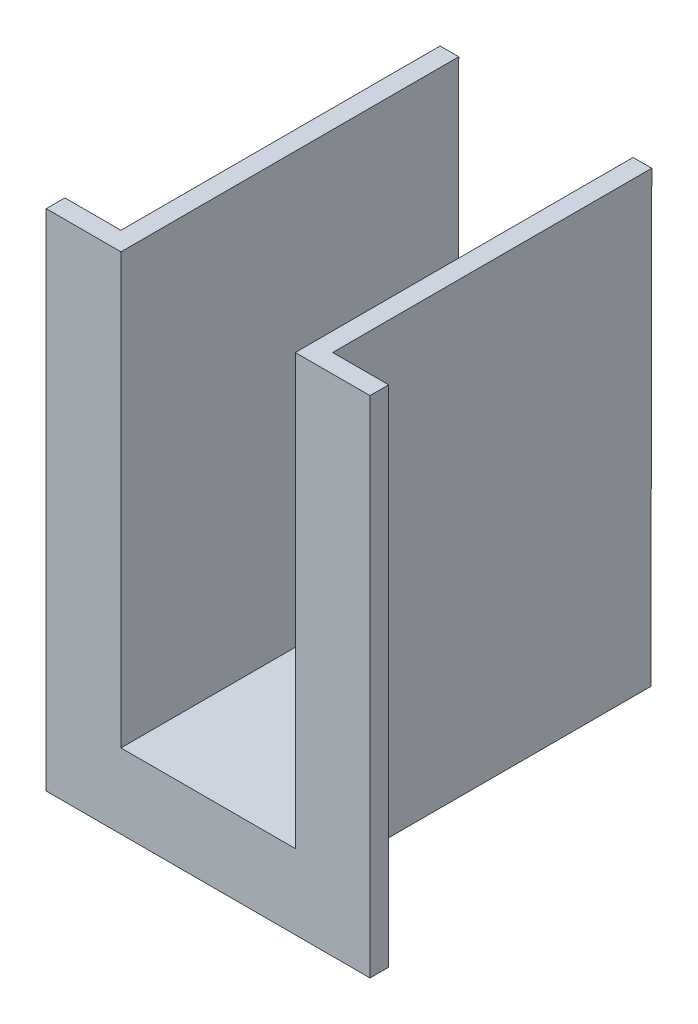
ISO-10303-21;
HEADER;
FILE_DESCRIPTION(('STEP AP214'),'2;1');
FILE_NAME('part.step','',(''),(''),'','','');
FILE_SCHEMA(('AUTOMOTIVE_DESIGN { 1 0 10303 214 1 1 1 1 }'));
ENDSEC;
DATA;
#1=APPLICATION_CONTEXT('core data for automotive mechanical design processes');
#2=APPLICATION_PROTOCOL_DEFINITION('international standard','automotive_design',2000,#1);
#3=PRODUCT_CONTEXT('',#1,'mechanical');
#4=PRODUCT('Part','Part','',(#3));
#5=PRODUCT_RELATED_PRODUCT_CATEGORY('part','',(#4));
#6=PRODUCT_DEFINITION_FORMATION('','',#4);
#7=PRODUCT_DEFINITION_CONTEXT('part definition',#1,'design');
#8=PRODUCT_DEFINITION('design','',#6,#7);
#9=PRODUCT_DEFINITION_SHAPE('','',#8);
#10=(LENGTH_UNIT() NAMED_UNIT(*) SI_UNIT(.MILLI.,.METRE.));
#11=(NAMED_UNIT(*) PLANE_ANGLE_UNIT() SI_UNIT($,.RADIAN.));
#12=(NAMED_UNIT(*) SI_UNIT($,.STERADIAN.) SOLID_ANGLE_UNIT());
#13=UNCERTAINTY_MEASURE_WITH_UNIT(LENGTH_MEASURE(1.E-05),#10,'distance_accuracy_value','');
#14=(GEOMETRIC_REPRESENTATION_CONTEXT(3) GLOBAL_UNCERTAINTY_ASSIGNED_CONTEXT((#13)) GLOBAL_UNIT_ASSIGNED_CONTEXT((#10,
#11,#12)) REPRESENTATION_CONTEXT('',''));
#15=CARTESIAN_POINT('',(0.,0.,0.));
#16=DIRECTION('',(0.,0.,1.));
#17=DIRECTION('',(1.,0.,0.));
#18=AXIS2_PLACEMENT_3D('',#15,#16,#17);
#19=CARTESIAN_POINT('',(-15.4784681413121,863.6,-103.829346654087));
#20=DIRECTION('',(0.,-1.,0.));
#21=DIRECTION('',(0.,0.,-1.));
#22=AXIS2_PLACEMENT_3D('',#19,#20,#21);
#23=PLANE('',#22);
#24=DIRECTION('',(-1.,0.,0.));
#25=VECTOR('',#24,1.);
#26=CARTESIAN_POINT('',(-15.4784681413121,863.6,-40.5731587359111));
#27=LINE('',#26,#25);
#28=CARTESIAN_POINT('',(11.5090318586879,863.6,-40.5731587359111));
#29=VERTEX_POINT('',#28);
#30=CARTESIAN_POINT('',(-15.4784681413121,863.6,-40.5731587359111));
#31=VERTEX_POINT('',#30);
#32=EDGE_CURVE('E381',#29,#31,#27,.T.);
#33=ORIENTED_EDGE('',*,*,#32,.F.);
#34=DIRECTION('',(0.,0.,1.));
#35=VECTOR('',#34,1.);
#36=CARTESIAN_POINT('',(11.5090318586879,863.6,-103.829346654087));
#37=LINE('',#36,#35);
#38=CARTESIAN_POINT('',(11.5090318586879,863.6,0.));
#39=VERTEX_POINT('',#38);
#40=EDGE_CURVE('E550',#29,#39,#37,.T.);
#41=ORIENTED_EDGE('',*,*,#40,.T.);
#42=DIRECTION('',(1.,0.,0.));
#43=VECTOR('',#42,1.);
#44=CARTESIAN_POINT('',(-15.4784681413121,863.6,0.));
#45=LINE('',#44,#43);
#46=CARTESIAN_POINT('',(-15.4784681413121,863.6,0.));
#47=VERTEX_POINT('',#46);
#48=EDGE_CURVE('E482',#47,#39,#45,.T.);
#49=ORIENTED_EDGE('',*,*,#48,.F.);
#50=DIRECTION('',(0.,0.,1.));
#51=VECTOR('',#50,1.);
#52=CARTESIAN_POINT('',(-15.4784681413121,863.6,-103.829346654087));
#53=LINE('',#52,#51);
#54=EDGE_CURVE('E515',#31,#47,#53,.T.);
#55=ORIENTED_EDGE('',*,*,#54,.F.);
#56=EDGE_LOOP('',(#33,#41,#49,#55));
#57=FACE_BOUND('',#56,.T.);
#58=ADVANCED_FACE('F370',(#57),#23,.T.);
#59=CARTESIAN_POINT('',(-15.4784681413121,920.75,-103.829346654087));
#60=DIRECTION('',(-1.,0.,0.));
#61=DIRECTION('',(0.,-1.,0.));
#62=AXIS2_PLACEMENT_3D('',#59,#60,#61);
#63=PLANE('',#62);
#64=DIRECTION('',(0.,0.999998182006501,-0.00190682555375038));
#65=VECTOR('',#64,1.);
#66=CARTESIAN_POINT('',(-15.4784681413121,920.870410499804,-40.6823636166597));
#67=LINE('',#66,#65);
#68=CARTESIAN_POINT('',(-15.4784681413121,920.75,-40.6821340144243));
#69=VERTEX_POINT('',#68);
#70=EDGE_CURVE('E527',#31,#69,#67,.T.);
#71=ORIENTED_EDGE('',*,*,#70,.F.);
#72=ORIENTED_EDGE('',*,*,#54,.T.);
#73=DIRECTION('',(0.,-1.,0.));
#74=VECTOR('',#73,1.);
#75=CARTESIAN_POINT('',(-15.4784681413121,920.75,0.));
#76=LINE('',#75,#74);
#77=CARTESIAN_POINT('',(-15.4784681413121,920.75,0.));
#78=VERTEX_POINT('',#77);
#79=EDGE_CURVE('E552',#78,#47,#76,.T.);
#80=ORIENTED_EDGE('',*,*,#79,.F.);
#81=DIRECTION('',(0.,0.,1.));
#82=VECTOR('',#81,1.);
#83=CARTESIAN_POINT('',(-15.4784681413121,920.75,-103.829346654087));
#84=LINE('',#83,#82);
#85=EDGE_CURVE('E417',#69,#78,#84,.T.);
#86=ORIENTED_EDGE('',*,*,#85,.F.);
#87=EDGE_LOOP('',(#71,#72,#80,#86));
#88=FACE_BOUND('',#87,.T.);
#89=ADVANCED_FACE('F632',(#88),#63,.T.);
#90=CARTESIAN_POINT('',(-15.4784681413121,920.75,-103.829346654087));
#91=DIRECTION('',(0.,1.,0.));
#92=DIRECTION('',(0.,0.,1.));
#93=AXIS2_PLACEMENT_3D('',#90,#91,#92);
#94=PLANE('',#93);
#95=DIRECTION('',(1.,0.,0.));
#96=VECTOR('',#95,1.);
#97=CARTESIAN_POINT('',(-15.4784681413121,920.75,-40.6821340144243));
#98=LINE('',#97,#96);
#99=CARTESIAN_POINT('',(-13.0972181413121,920.75,-40.6821340144243));
#100=VERTEX_POINT('',#99);
#101=EDGE_CURVE('E524',#69,#100,#98,.T.);
#102=ORIENTED_EDGE('',*,*,#101,.F.);
#103=ORIENTED_EDGE('',*,*,#85,.T.);
#104=DIRECTION('',(-1.,0.,0.));
#105=VECTOR('',#104,1.);
#106=CARTESIAN_POINT('',(-13.0972181413121,920.75,0.));
#107=LINE('',#106,#105);
#108=CARTESIAN_POINT('',(-22.6222181413121,920.75,0.));
#109=VERTEX_POINT('',#108);
#110=EDGE_CURVE('E464',#78,#109,#107,.T.);
#111=ORIENTED_EDGE('',*,*,#110,.T.);
#112=DIRECTION('',(0.,0.,-1.));
#113=VECTOR('',#112,1.);
#114=CARTESIAN_POINT('',(-22.6222181413121,920.75,2.38125));
#115=LINE('',#114,#113);
#116=CARTESIAN_POINT('',(-22.6222181413121,920.75,2.38125));
#117=VERTEX_POINT('',#116);
#118=EDGE_CURVE('E468',#117,#109,#115,.T.);
#119=ORIENTED_EDGE('',*,*,#118,.F.);
#120=DIRECTION('',(-1.,0.,0.));
#121=VECTOR('',#120,1.);
#122=CARTESIAN_POINT('',(-13.0972181413121,920.75,2.38125));
#123=LINE('',#122,#121);
#124=CARTESIAN_POINT('',(-13.0972181413121,920.75,2.38125));
#125=VERTEX_POINT('',#124);
#126=EDGE_CURVE('E602',#125,#117,#123,.T.);
#127=ORIENTED_EDGE('',*,*,#126,.F.);
#128=DIRECTION('',(0.,0.,1.));
#129=VECTOR('',#128,1.);
#130=CARTESIAN_POINT('',(-13.0972181413121,920.75,-103.829346654087));
#131=LINE('',#130,#129);
#132=EDGE_CURVE('E538',#100,#125,#131,.T.);
#133=ORIENTED_EDGE('',*,*,#132,.F.);
#134=EDGE_LOOP('',(#102,#103,#111,#119,#127,#133));
#135=FACE_BOUND('',#134,.T.);
#136=ADVANCED_FACE('F466',(#135),#94,.T.);
#137=CARTESIAN_POINT('',(-13.0972181413121,920.75,-103.829346654087));
#138=DIRECTION('',(1.,0.,0.));
#139=DIRECTION('',(0.,1.,0.));
#140=AXIS2_PLACEMENT_3D('',#137,#138,#139);
#141=PLANE('',#140);
#142=DIRECTION('',(0.,-0.999998182006501,0.00190682555375038));
#143=VECTOR('',#142,1.);
#144=CARTESIAN_POINT('',(-13.0972181413121,920.870410499804,-40.6823636166597));
#145=LINE('',#144,#143);
#146=CARTESIAN_POINT('',(-13.0972181413121,865.98125,-40.5776993725158));
#147=VERTEX_POINT('',#146);
#148=EDGE_CURVE('E521',#100,#147,#145,.T.);
#149=ORIENTED_EDGE('',*,*,#148,.F.);
#150=ORIENTED_EDGE('',*,*,#132,.T.);
#151=DIRECTION('',(0.,1.,0.));
#152=VECTOR('',#151,1.);
#153=CARTESIAN_POINT('',(-13.0972181413121,865.98125,2.38125));
#154=LINE('',#153,#152);
#155=CARTESIAN_POINT('',(-13.0972181413121,865.98125,2.38125));
#156=VERTEX_POINT('',#155);
#157=EDGE_CURVE('E607',#156,#125,#154,.T.);
#158=ORIENTED_EDGE('',*,*,#157,.F.);
#159=DIRECTION('',(0.,0.,1.));
#160=VECTOR('',#159,1.);
#161=CARTESIAN_POINT('',(-13.0972181413121,865.98125,-103.829346654087));
#162=LINE('',#161,#160);
#163=EDGE_CURVE('E541',#147,#156,#162,.T.);
#164=ORIENTED_EDGE('',*,*,#163,.F.);
#165=EDGE_LOOP('',(#149,#150,#158,#164));
#166=FACE_BOUND('',#165,.T.);
#167=ADVANCED_FACE('F629',(#166),#141,.T.);
#168=CARTESIAN_POINT('',(-13.0972181413121,865.98125,-103.829346654087));
#169=DIRECTION('',(0.,1.,0.));
#170=DIRECTION('',(0.,0.,1.));
#171=AXIS2_PLACEMENT_3D('',#168,#169,#170);
#172=PLANE('',#171);
#173=DIRECTION('',(1.,0.,0.));
#174=VECTOR('',#173,1.);
#175=CARTESIAN_POINT('',(-13.0972181413121,865.98125,-40.5776993725158));
#176=LINE('',#175,#174);
#177=CARTESIAN_POINT('',(9.12778185868792,865.98125,-40.5776993725158));
#178=VERTEX_POINT('',#177);
#179=EDGE_CURVE('E518',#147,#178,#176,.T.);
#180=ORIENTED_EDGE('',*,*,#179,.F.);
#181=ORIENTED_EDGE('',*,*,#163,.T.);
#182=DIRECTION('',(-1.,0.,0.));
#183=VECTOR('',#182,1.);
#184=CARTESIAN_POINT('',(9.12778185868792,865.98125,2.38125));
#185=LINE('',#184,#183);
#186=CARTESIAN_POINT('',(9.12778185868792,865.98125,2.38125));
#187=VERTEX_POINT('',#186);
#188=EDGE_CURVE('E609',#187,#156,#185,.T.);
#189=ORIENTED_EDGE('',*,*,#188,.F.);
#190=DIRECTION('',(0.,0.,1.));
#191=VECTOR('',#190,1.);
#192=CARTESIAN_POINT('',(9.12778185868792,865.98125,-103.829346654087));
#193=LINE('',#192,#191);
#194=EDGE_CURVE('E544',#178,#187,#193,.T.);
#195=ORIENTED_EDGE('',*,*,#194,.F.);
#196=EDGE_LOOP('',(#180,#181,#189,#195));
#197=FACE_BOUND('',#196,.T.);
#198=ADVANCED_FACE('F625',(#197),#172,.T.);
#199=CARTESIAN_POINT('',(9.12778185868792,865.98125,-103.829346654087));
#200=DIRECTION('',(-1.,0.,0.));
#201=DIRECTION('',(0.,-1.,0.));
#202=AXIS2_PLACEMENT_3D('',#199,#200,#201);
#203=PLANE('',#202);
#204=DIRECTION('',(0.,0.999998182006501,-0.00190682555375038));
#205=VECTOR('',#204,1.);
#206=CARTESIAN_POINT('',(9.12778185868792,866.101859638086,-40.5779293544738));
#207=LINE('',#206,#205);
#208=CARTESIAN_POINT('',(9.12778185868791,920.75,-40.6821340144243));
#209=VERTEX_POINT('',#208);
#210=EDGE_CURVE('E514',#178,#209,#207,.T.);
#211=ORIENTED_EDGE('',*,*,#210,.F.);
#212=ORIENTED_EDGE('',*,*,#194,.T.);
#213=DIRECTION('',(0.,-1.,0.));
#214=VECTOR('',#213,1.);
#215=CARTESIAN_POINT('',(9.12778185868791,920.75,2.38125));
#216=LINE('',#215,#214);
#217=CARTESIAN_POINT('',(9.12778185868791,920.75,2.38125));
#218=VERTEX_POINT('',#217);
#219=EDGE_CURVE('E505',#218,#187,#216,.T.);
#220=ORIENTED_EDGE('',*,*,#219,.F.);
#221=DIRECTION('',(0.,0.,1.));
#222=VECTOR('',#221,1.);
#223=CARTESIAN_POINT('',(9.12778185868791,920.75,-103.829346654087));
#224=LINE('',#223,#222);
#225=EDGE_CURVE('E546',#209,#218,#224,.T.);
#226=ORIENTED_EDGE('',*,*,#225,.F.);
#227=EDGE_LOOP('',(#211,#212,#220,#226));
#228=FACE_BOUND('',#227,.T.);
#229=ADVANCED_FACE('F621',(#228),#203,.T.);
#230=CARTESIAN_POINT('',(9.12778185868791,920.75,-103.829346654087));
#231=DIRECTION('',(0.,1.,0.));
#232=DIRECTION('',(0.,0.,1.));
#233=AXIS2_PLACEMENT_3D('',#230,#231,#232);
#234=PLANE('',#233);
#235=DIRECTION('',(1.,0.,0.));
#236=VECTOR('',#235,1.);
#237=CARTESIAN_POINT('',(9.12778185868791,920.75,-40.6821340144243));
#238=LINE('',#237,#236);
#239=CARTESIAN_POINT('',(11.5090318586879,920.75,-40.6821340144243));
#240=VERTEX_POINT('',#239);
#241=EDGE_CURVE('E409',#209,#240,#238,.T.);
#242=ORIENTED_EDGE('',*,*,#241,.F.);
#243=ORIENTED_EDGE('',*,*,#225,.T.);
#244=DIRECTION('',(-1.,0.,0.));
#245=VECTOR('',#244,1.);
#246=CARTESIAN_POINT('',(18.6527818586879,920.75,2.38125));
#247=LINE('',#246,#245);
#248=CARTESIAN_POINT('',(18.6527818586879,920.75,2.38125));
#249=VERTEX_POINT('',#248);
#250=EDGE_CURVE('E579',#249,#218,#247,.T.);
#251=ORIENTED_EDGE('',*,*,#250,.F.);
#252=DIRECTION('',(0.,0.,-1.));
#253=VECTOR('',#252,1.);
#254=CARTESIAN_POINT('',(18.6527818586879,920.75,2.38125));
#255=LINE('',#254,#253);
#256=CARTESIAN_POINT('',(18.6527818586879,920.75,0.));
#257=VERTEX_POINT('',#256);
#258=EDGE_CURVE('E577',#249,#257,#255,.T.);
#259=ORIENTED_EDGE('',*,*,#258,.T.);
#260=DIRECTION('',(-1.,0.,0.));
#261=VECTOR('',#260,1.);
#262=CARTESIAN_POINT('',(18.6527818586879,920.75,0.));
#263=LINE('',#262,#261);
#264=CARTESIAN_POINT('',(11.5090318586879,920.75,0.));
#265=VERTEX_POINT('',#264);
#266=EDGE_CURVE('E502',#257,#265,#263,.T.);
#267=ORIENTED_EDGE('',*,*,#266,.T.);
#268=DIRECTION('',(0.,0.,1.));
#269=VECTOR('',#268,1.);
#270=CARTESIAN_POINT('',(11.5090318586879,920.75,-103.829346654087));
#271=LINE('',#270,#269);
#272=EDGE_CURVE('E549',#240,#265,#271,.T.);
#273=ORIENTED_EDGE('',*,*,#272,.F.);
#274=EDGE_LOOP('',(#242,#243,#251,#259,#267,#273));
#275=FACE_BOUND('',#274,.T.);
#276=ADVANCED_FACE('F574',(#275),#234,.T.);
#277=CARTESIAN_POINT('',(11.5090318586879,863.6,-103.829346654087));
#278=DIRECTION('',(1.,0.,0.));
#279=DIRECTION('',(0.,1.,0.));
#280=AXIS2_PLACEMENT_3D('',#277,#278,#279);
#281=PLANE('',#280);
#282=DIRECTION('',(0.,-0.999998182006501,0.00190682555375038));
#283=VECTOR('',#282,1.);
#284=CARTESIAN_POINT('',(11.5090318586879,863.720618296272,-40.5733887343788));
#285=LINE('',#284,#283);
#286=EDGE_CURVE('E11',#240,#29,#285,.T.);
#287=ORIENTED_EDGE('',*,*,#286,.F.);
#288=ORIENTED_EDGE('',*,*,#272,.T.);
#289=DIRECTION('',(0.,1.,0.));
#290=VECTOR('',#289,1.);
#291=CARTESIAN_POINT('',(11.5090318586879,863.6,0.));
#292=LINE('',#291,#290);
#293=EDGE_CURVE('E373',#39,#265,#292,.T.);
#294=ORIENTED_EDGE('',*,*,#293,.F.);
#295=ORIENTED_EDGE('',*,*,#40,.F.);
#296=EDGE_LOOP('',(#287,#288,#294,#295));
#297=FACE_BOUND('',#296,.T.);
#298=ADVANCED_FACE('F568',(#297),#281,.T.);
#299=CARTESIAN_POINT('',(-46.0537181413121,942.958625716051,-40.7244820664418));
#300=DIRECTION('',(0.,0.00190682555375038,0.999998182006501));
#301=DIRECTION('',(-1.,0.,0.));
#302=AXIS2_PLACEMENT_3D('',#299,#300,#301);
#303=PLANE('',#302);
#304=ORIENTED_EDGE('',*,*,#32,.T.);
#305=ORIENTED_EDGE('',*,*,#70,.T.);
#306=ORIENTED_EDGE('',*,*,#101,.T.);
#307=ORIENTED_EDGE('',*,*,#148,.T.);
#308=ORIENTED_EDGE('',*,*,#179,.T.);
#309=ORIENTED_EDGE('',*,*,#210,.T.);
#310=ORIENTED_EDGE('',*,*,#241,.T.);
#311=ORIENTED_EDGE('',*,*,#286,.T.);
#312=EDGE_LOOP('',(#304,#305,#306,#307,#308,#309,#310,#311));
#313=FACE_BOUND('',#312,.T.);
#314=ADVANCED_FACE('F643',(#313),#303,.F.);
#315=CARTESIAN_POINT('',(-22.6222181413121,856.45625,2.38125));
#316=DIRECTION('',(1.,0.,0.));
#317=DIRECTION('',(0.,0.,-1.));
#318=AXIS2_PLACEMENT_3D('',#315,#316,#317);
#319=PLANE('',#318);
#320=DIRECTION('',(0.,-1.,0.));
#321=VECTOR('',#320,1.);
#322=CARTESIAN_POINT('',(-22.6222181413121,856.45625,0.));
#323=LINE('',#322,#321);
#324=CARTESIAN_POINT('',(-22.6222181413121,856.45625,0.));
#325=VERTEX_POINT('',#324);
#326=EDGE_CURVE('E474',#109,#325,#323,.T.);
#327=ORIENTED_EDGE('',*,*,#326,.T.);
#328=DIRECTION('',(0.,0.,-1.));
#329=VECTOR('',#328,1.);
#330=CARTESIAN_POINT('',(-22.6222181413121,856.45625,2.38125));
#331=LINE('',#330,#329);
#332=CARTESIAN_POINT('',(-22.6222181413121,856.45625,2.38125));
#333=VERTEX_POINT('',#332);
#334=EDGE_CURVE('E483',#333,#325,#331,.T.);
#335=ORIENTED_EDGE('',*,*,#334,.F.);
#336=DIRECTION('',(0.,-1.,0.));
#337=VECTOR('',#336,1.);
#338=CARTESIAN_POINT('',(-22.6222181413121,856.45625,2.38125));
#339=LINE('',#338,#337);
#340=EDGE_CURVE('E480',#117,#333,#339,.T.);
#341=ORIENTED_EDGE('',*,*,#340,.F.);
#342=ORIENTED_EDGE('',*,*,#118,.T.);
#343=EDGE_LOOP('',(#327,#335,#341,#342));
#344=FACE_BOUND('',#343,.T.);
#345=ADVANCED_FACE('F477',(#344),#319,.F.);
#346=CARTESIAN_POINT('',(18.6527818586879,856.45625,2.38125));
#347=DIRECTION('',(0.,1.,0.));
#348=DIRECTION('',(0.,0.,1.));
#349=AXIS2_PLACEMENT_3D('',#346,#347,#348);
#350=PLANE('',#349);
#351=DIRECTION('',(1.,0.,0.));
#352=VECTOR('',#351,1.);
#353=CARTESIAN_POINT('',(18.6527818586879,856.45625,0.));
#354=LINE('',#353,#352);
#355=CARTESIAN_POINT('',(18.6527818586879,856.45625,0.));
#356=VERTEX_POINT('',#355);
#357=EDGE_CURVE('E489',#325,#356,#354,.T.);
#358=ORIENTED_EDGE('',*,*,#357,.T.);
#359=DIRECTION('',(0.,0.,-1.));
#360=VECTOR('',#359,1.);
#361=CARTESIAN_POINT('',(18.6527818586879,856.45625,2.38125));
#362=LINE('',#361,#360);
#363=CARTESIAN_POINT('',(18.6527818586879,856.45625,2.38125));
#364=VERTEX_POINT('',#363);
#365=EDGE_CURVE('E582',#364,#356,#362,.T.);
#366=ORIENTED_EDGE('',*,*,#365,.F.);
#367=DIRECTION('',(1.,0.,0.));
#368=VECTOR('',#367,1.);
#369=CARTESIAN_POINT('',(18.6527818586879,856.45625,2.38125));
#370=LINE('',#369,#368);
#371=EDGE_CURVE('E597',#333,#364,#370,.T.);
#372=ORIENTED_EDGE('',*,*,#371,.F.);
#373=ORIENTED_EDGE('',*,*,#334,.T.);
#374=EDGE_LOOP('',(#358,#366,#372,#373));
#375=FACE_BOUND('',#374,.T.);
#376=ADVANCED_FACE('F595',(#375),#350,.F.);
#377=CARTESIAN_POINT('',(18.6527818586879,920.75,2.38125));
#378=DIRECTION('',(-1.,0.,0.));
#379=DIRECTION('',(0.,-1.,0.));
#380=AXIS2_PLACEMENT_3D('',#377,#378,#379);
#381=PLANE('',#380);
#382=DIRECTION('',(0.,1.,0.));
#383=VECTOR('',#382,1.);
#384=CARTESIAN_POINT('',(18.6527818586879,920.75,0.));
#385=LINE('',#384,#383);
#386=EDGE_CURVE('E495',#356,#257,#385,.T.);
#387=ORIENTED_EDGE('',*,*,#386,.T.);
#388=ORIENTED_EDGE('',*,*,#258,.F.);
#389=DIRECTION('',(0.,1.,0.));
#390=VECTOR('',#389,1.);
#391=CARTESIAN_POINT('',(18.6527818586879,920.75,2.38125));
#392=LINE('',#391,#390);
#393=EDGE_CURVE('E588',#364,#249,#392,.T.);
#394=ORIENTED_EDGE('',*,*,#393,.F.);
#395=ORIENTED_EDGE('',*,*,#365,.T.);
#396=EDGE_LOOP('',(#387,#388,#394,#395));
#397=FACE_BOUND('',#396,.T.);
#398=ADVANCED_FACE('F660',(#397),#381,.F.);
#399=CARTESIAN_POINT('',(9.12778185868792,865.98125,2.38125));
#400=DIRECTION('',(0.,0.,-1.));
#401=DIRECTION('',(-1.,0.,0.));
#402=AXIS2_PLACEMENT_3D('',#399,#400,#401);
#403=PLANE('',#402);
#404=ORIENTED_EDGE('',*,*,#219,.T.);
#405=ORIENTED_EDGE('',*,*,#188,.T.);
#406=ORIENTED_EDGE('',*,*,#157,.T.);
#407=ORIENTED_EDGE('',*,*,#126,.T.);
#408=ORIENTED_EDGE('',*,*,#340,.T.);
#409=ORIENTED_EDGE('',*,*,#371,.T.);
#410=ORIENTED_EDGE('',*,*,#393,.T.);
#411=ORIENTED_EDGE('',*,*,#250,.T.);
#412=EDGE_LOOP('',(#404,#405,#406,#407,#408,#409,#410,#411));
#413=FACE_BOUND('',#412,.T.);
#414=ADVANCED_FACE('F617',(#413),#403,.F.);
#415=CARTESIAN_POINT('',(9.12778185868792,865.98125,0.));
#416=DIRECTION('',(0.,0.,-1.));
#417=DIRECTION('',(-1.,0.,0.));
#418=AXIS2_PLACEMENT_3D('',#415,#416,#417);
#419=PLANE('',#418);
#420=ORIENTED_EDGE('',*,*,#48,.T.);
#421=ORIENTED_EDGE('',*,*,#293,.T.);
#422=ORIENTED_EDGE('',*,*,#266,.F.);
#423=ORIENTED_EDGE('',*,*,#386,.F.);
#424=ORIENTED_EDGE('',*,*,#357,.F.);
#425=ORIENTED_EDGE('',*,*,#326,.F.);
#426=ORIENTED_EDGE('',*,*,#110,.F.);
#427=ORIENTED_EDGE('',*,*,#79,.T.);
#428=EDGE_LOOP('',(#420,#421,#422,#423,#424,#425,#426,#427));
#429=FACE_BOUND('',#428,.T.);
#430=ADVANCED_FACE('F487',(#429),#419,.T.);
#431=CLOSED_SHELL('',(#58,#89,#136,#167,#198,#229,#276,#298,#314,#345,#376,#398,#414,#430));
#432=MANIFOLD_SOLID_BREP('B2',#431);
#433=ADVANCED_BREP_SHAPE_REPRESENTATION('',(#18,#432),#14);
#434=SHAPE_DEFINITION_REPRESENTATION(#9,#433);
ENDSEC;
END-ISO-10303-21;
